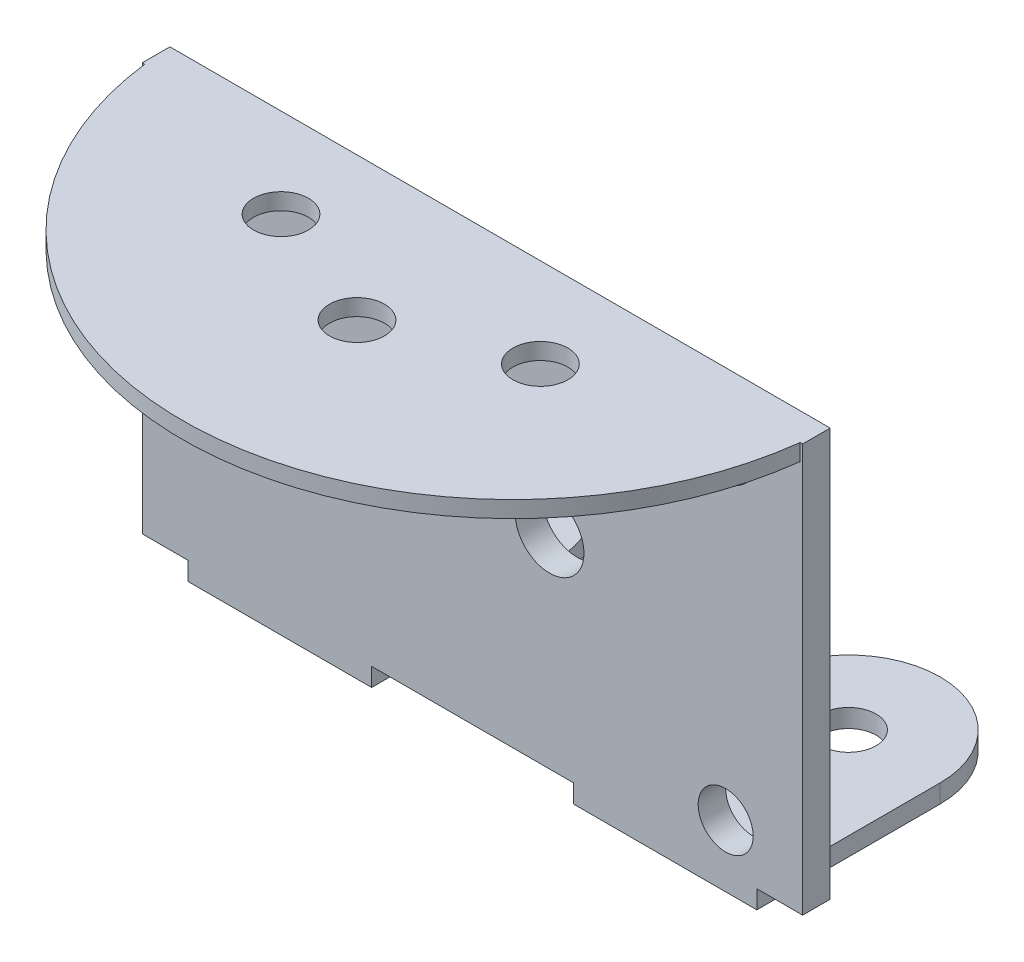
ISO-10303-21;
HEADER;
FILE_DESCRIPTION(('STEP AP214'),'2;1');
FILE_NAME('part.step','',(''),(''),'','','');
FILE_SCHEMA(('AUTOMOTIVE_DESIGN { 1 0 10303 214 1 1 1 1 }'));
ENDSEC;
DATA;
#1=APPLICATION_CONTEXT('core data for automotive mechanical design processes');
#2=APPLICATION_PROTOCOL_DEFINITION('international standard','automotive_design',2000,#1);
#3=PRODUCT_CONTEXT('',#1,'mechanical');
#4=PRODUCT('Part','Part','',(#3));
#5=PRODUCT_RELATED_PRODUCT_CATEGORY('part','',(#4));
#6=PRODUCT_DEFINITION_FORMATION('','',#4);
#7=PRODUCT_DEFINITION_CONTEXT('part definition',#1,'design');
#8=PRODUCT_DEFINITION('design','',#6,#7);
#9=PRODUCT_DEFINITION_SHAPE('','',#8);
#10=(LENGTH_UNIT() NAMED_UNIT(*) SI_UNIT(.MILLI.,.METRE.));
#11=(NAMED_UNIT(*) PLANE_ANGLE_UNIT() SI_UNIT($,.RADIAN.));
#12=(NAMED_UNIT(*) SI_UNIT($,.STERADIAN.) SOLID_ANGLE_UNIT());
#13=UNCERTAINTY_MEASURE_WITH_UNIT(LENGTH_MEASURE(1.E-05),#10,'distance_accuracy_value','');
#14=(GEOMETRIC_REPRESENTATION_CONTEXT(3) GLOBAL_UNCERTAINTY_ASSIGNED_CONTEXT((#13)) GLOBAL_UNIT_ASSIGNED_CONTEXT((#10,
#11,#12)) REPRESENTATION_CONTEXT('',''));
#15=CARTESIAN_POINT('',(0.,0.,0.));
#16=DIRECTION('',(0.,0.,1.));
#17=DIRECTION('',(1.,0.,0.));
#18=AXIS2_PLACEMENT_3D('',#15,#16,#17);
#19=CARTESIAN_POINT('',(13.8,8.74499999999999,1.5));
#20=DIRECTION('',(0.,0.,-1.));
#21=DIRECTION('',(-1.,0.,0.));
#22=AXIS2_PLACEMENT_3D('',#19,#20,#21);
#23=CYLINDRICAL_SURFACE('',#22,1.5);
#24=CARTESIAN_POINT('',(13.8,8.74499999999999,1.5));
#25=DIRECTION('',(0.,0.,1.));
#26=DIRECTION('',(1.,0.,0.));
#27=AXIS2_PLACEMENT_3D('',#24,#25,#26);
#28=CIRCLE('',#27,1.5);
#29=CARTESIAN_POINT('',(13.5558688876854,10.225,1.5));
#30=VERTEX_POINT('',#29);
#31=CARTESIAN_POINT('',(14.0441311123146,10.225,1.5));
#32=VERTEX_POINT('',#31);
#33=EDGE_CURVE('E187',#30,#32,#28,.T.);
#34=ORIENTED_EDGE('',*,*,#33,.T.);
#35=DIRECTION('',(0.,0.,-1.));
#36=VECTOR('',#35,1.);
#37=CARTESIAN_POINT('',(14.0441311123146,10.225,1.5));
#38=LINE('',#37,#36);
#39=CARTESIAN_POINT('',(14.0441311123146,10.225,0.));
#40=VERTEX_POINT('',#39);
#41=EDGE_CURVE('E11',#32,#40,#38,.T.);
#42=ORIENTED_EDGE('',*,*,#41,.T.);
#43=CARTESIAN_POINT('',(13.8,8.74499999999999,0.));
#44=DIRECTION('',(0.,0.,1.));
#45=DIRECTION('',(1.,0.,0.));
#46=AXIS2_PLACEMENT_3D('',#43,#44,#45);
#47=CIRCLE('',#46,1.5);
#48=CARTESIAN_POINT('',(13.5558688876854,10.225,0.));
#49=VERTEX_POINT('',#48);
#50=EDGE_CURVE('E286',#49,#40,#47,.T.);
#51=ORIENTED_EDGE('',*,*,#50,.F.);
#52=DIRECTION('',(0.,0.,-1.));
#53=VECTOR('',#52,1.);
#54=CARTESIAN_POINT('',(13.5558688876854,10.225,1.5));
#55=LINE('',#54,#53);
#56=EDGE_CURVE('E47',#49,#30,#55,.F.);
#57=ORIENTED_EDGE('',*,*,#56,.T.);
#58=EDGE_LOOP('',(#34,#42,#51,#57));
#59=FACE_BOUND('',#58,.T.);
#60=ADVANCED_FACE('F39',(#59),#23,.F.);
#61=CARTESIAN_POINT('',(-18.,-11.125,1.5));
#62=DIRECTION('',(0.,1.,0.));
#63=DIRECTION('',(-1.,0.,0.));
#64=AXIS2_PLACEMENT_3D('',#61,#62,#63);
#65=PLANE('',#64);
#66=DIRECTION('',(0.,0.,1.));
#67=VECTOR('',#66,1.);
#68=CARTESIAN_POINT('',(15.5,-11.125,0.));
#69=LINE('',#68,#67);
#70=CARTESIAN_POINT('',(15.5,-11.125,0.));
#71=VERTEX_POINT('',#70);
#72=CARTESIAN_POINT('',(15.5,-11.125,1.5));
#73=VERTEX_POINT('',#72);
#74=EDGE_CURVE('E220',#71,#73,#69,.T.);
#75=ORIENTED_EDGE('',*,*,#74,.F.);
#76=DIRECTION('',(1.,0.,0.));
#77=VECTOR('',#76,1.);
#78=CARTESIAN_POINT('',(-18.,-11.125,0.));
#79=LINE('',#78,#77);
#80=CARTESIAN_POINT('',(18.,-11.125,0.));
#81=VERTEX_POINT('',#80);
#82=EDGE_CURVE('E314',#71,#81,#79,.T.);
#83=ORIENTED_EDGE('',*,*,#82,.T.);
#84=DIRECTION('',(0.,0.,-1.));
#85=VECTOR('',#84,1.);
#86=CARTESIAN_POINT('',(18.,-11.125,1.5));
#87=LINE('',#86,#85);
#88=CARTESIAN_POINT('',(18.,-11.125,1.5));
#89=VERTEX_POINT('',#88);
#90=EDGE_CURVE('E306',#89,#81,#87,.T.);
#91=ORIENTED_EDGE('',*,*,#90,.F.);
#92=DIRECTION('',(1.,0.,0.));
#93=VECTOR('',#92,1.);
#94=CARTESIAN_POINT('',(-18.,-11.125,1.5));
#95=LINE('',#94,#93);
#96=EDGE_CURVE('E62',#73,#89,#95,.T.);
#97=ORIENTED_EDGE('',*,*,#96,.F.);
#98=EDGE_LOOP('',(#75,#83,#91,#97));
#99=FACE_BOUND('',#98,.T.);
#100=ADVANCED_FACE('F371',(#99),#65,.F.);
#101=CARTESIAN_POINT('',(-5.49999999999999,-11.125,0.));
#102=VERTEX_POINT('',#101);
#103=CARTESIAN_POINT('',(5.50000000000001,-11.125,0.));
#104=VERTEX_POINT('',#103);
#105=EDGE_CURVE('E733',#102,#104,#79,.T.);
#106=ORIENTED_EDGE('',*,*,#105,.T.);
#107=DIRECTION('',(0.,0.,1.));
#108=VECTOR('',#107,1.);
#109=CARTESIAN_POINT('',(5.50000000000001,-11.125,0.));
#110=LINE('',#109,#108);
#111=CARTESIAN_POINT('',(5.50000000000001,-11.125,1.5));
#112=VERTEX_POINT('',#111);
#113=EDGE_CURVE('E213',#104,#112,#110,.T.);
#114=ORIENTED_EDGE('',*,*,#113,.T.);
#115=CARTESIAN_POINT('',(-5.49999999999999,-11.125,1.5));
#116=VERTEX_POINT('',#115);
#117=EDGE_CURVE('E307',#116,#112,#95,.T.);
#118=ORIENTED_EDGE('',*,*,#117,.F.);
#119=DIRECTION('',(0.,0.,1.));
#120=VECTOR('',#119,1.);
#121=CARTESIAN_POINT('',(-5.49999999999999,-11.125,0.));
#122=LINE('',#121,#120);
#123=EDGE_CURVE('E255',#102,#116,#122,.T.);
#124=ORIENTED_EDGE('',*,*,#123,.F.);
#125=EDGE_LOOP('',(#106,#114,#118,#124));
#126=FACE_BOUND('',#125,.T.);
#127=ADVANCED_FACE('F376',(#126),#65,.F.);
#128=CARTESIAN_POINT('',(0.,0.,1.5));
#129=DIRECTION('',(0.,0.,-1.));
#130=DIRECTION('',(-1.,0.,0.));
#131=AXIS2_PLACEMENT_3D('',#128,#129,#130);
#132=PLANE('',#131);
#133=DIRECTION('',(1.,0.,0.));
#134=VECTOR('',#133,1.);
#135=CARTESIAN_POINT('',(0.,10.225,1.5));
#136=LINE('',#135,#134);
#137=CARTESIAN_POINT('',(-17.8650496780726,10.225,1.5));
#138=VERTEX_POINT('',#137);
#139=EDGE_CURVE('E54',#138,#30,#136,.T.);
#140=ORIENTED_EDGE('',*,*,#139,.F.);
#141=DIRECTION('',(0.,1.,0.));
#142=VECTOR('',#141,1.);
#143=CARTESIAN_POINT('',(-17.8650496780726,10.225,1.5));
#144=LINE('',#143,#142);
#145=CARTESIAN_POINT('',(-17.8650496780726,11.125,1.5));
#146=VERTEX_POINT('',#145);
#147=EDGE_CURVE('E166',#138,#146,#144,.T.);
#148=ORIENTED_EDGE('',*,*,#147,.T.);
#149=DIRECTION('',(-1.,0.,0.));
#150=VECTOR('',#149,1.);
#151=CARTESIAN_POINT('',(-18.,11.125,1.5));
#152=LINE('',#151,#150);
#153=CARTESIAN_POINT('',(-18.,11.125,1.5));
#154=VERTEX_POINT('',#153);
#155=EDGE_CURVE('E296',#146,#154,#152,.T.);
#156=ORIENTED_EDGE('',*,*,#155,.T.);
#157=DIRECTION('',(0.,-1.,0.));
#158=VECTOR('',#157,1.);
#159=CARTESIAN_POINT('',(-18.,-11.125,1.5));
#160=LINE('',#159,#158);
#161=CARTESIAN_POINT('',(-18.,-11.125,1.5));
#162=VERTEX_POINT('',#161);
#163=EDGE_CURVE('E301',#154,#162,#160,.T.);
#164=ORIENTED_EDGE('',*,*,#163,.T.);
#165=CARTESIAN_POINT('',(-15.5,-11.125,1.5));
#166=VERTEX_POINT('',#165);
#167=EDGE_CURVE('E303',#162,#166,#95,.T.);
#168=ORIENTED_EDGE('',*,*,#167,.T.);
#169=DIRECTION('',(0.,1.,0.));
#170=VECTOR('',#169,1.);
#171=CARTESIAN_POINT('',(-15.5,-12.125,1.5));
#172=LINE('',#171,#170);
#173=CARTESIAN_POINT('',(-15.5,-12.125,1.5));
#174=VERTEX_POINT('',#173);
#175=EDGE_CURVE('E262',#174,#166,#172,.T.);
#176=ORIENTED_EDGE('',*,*,#175,.F.);
#177=DIRECTION('',(-1.,0.,0.));
#178=VECTOR('',#177,1.);
#179=CARTESIAN_POINT('',(0.,-12.125,1.5));
#180=LINE('',#179,#178);
#181=CARTESIAN_POINT('',(-5.49999999999999,-12.125,1.5));
#182=VERTEX_POINT('',#181);
#183=EDGE_CURVE('E240',#182,#174,#180,.T.);
#184=ORIENTED_EDGE('',*,*,#183,.F.);
#185=DIRECTION('',(0.,1.,0.));
#186=VECTOR('',#185,1.);
#187=CARTESIAN_POINT('',(-5.49999999999999,-12.125,1.5));
#188=LINE('',#187,#186);
#189=EDGE_CURVE('E265',#182,#116,#188,.T.);
#190=ORIENTED_EDGE('',*,*,#189,.T.);
#191=ORIENTED_EDGE('',*,*,#117,.T.);
#192=DIRECTION('',(0.,1.,0.));
#193=VECTOR('',#192,1.);
#194=CARTESIAN_POINT('',(5.50000000000001,-12.125,1.5));
#195=LINE('',#194,#193);
#196=CARTESIAN_POINT('',(5.50000000000001,-12.125,1.5));
#197=VERTEX_POINT('',#196);
#198=EDGE_CURVE('E210',#197,#112,#195,.T.);
#199=ORIENTED_EDGE('',*,*,#198,.F.);
#200=DIRECTION('',(-1.,0.,0.));
#201=VECTOR('',#200,1.);
#202=CARTESIAN_POINT('',(0.,-12.125,1.5));
#203=LINE('',#202,#201);
#204=CARTESIAN_POINT('',(15.5,-12.125,1.5));
#205=VERTEX_POINT('',#204);
#206=EDGE_CURVE('E208',#205,#197,#203,.T.);
#207=ORIENTED_EDGE('',*,*,#206,.F.);
#208=DIRECTION('',(0.,1.,0.));
#209=VECTOR('',#208,1.);
#210=CARTESIAN_POINT('',(15.5,-12.125,1.5));
#211=LINE('',#210,#209);
#212=EDGE_CURVE('E225',#205,#73,#211,.T.);
#213=ORIENTED_EDGE('',*,*,#212,.T.);
#214=ORIENTED_EDGE('',*,*,#96,.T.);
#215=DIRECTION('',(0.,1.,0.));
#216=VECTOR('',#215,1.);
#217=CARTESIAN_POINT('',(18.,-11.125,1.5));
#218=LINE('',#217,#216);
#219=CARTESIAN_POINT('',(18.,11.125,1.5));
#220=VERTEX_POINT('',#219);
#221=EDGE_CURVE('E293',#89,#220,#218,.T.);
#222=ORIENTED_EDGE('',*,*,#221,.T.);
#223=CARTESIAN_POINT('',(17.8650496780725,11.125,1.5));
#224=VERTEX_POINT('',#223);
#225=EDGE_CURVE('E298',#220,#224,#152,.T.);
#226=ORIENTED_EDGE('',*,*,#225,.T.);
#227=DIRECTION('',(0.,1.,0.));
#228=VECTOR('',#227,1.);
#229=CARTESIAN_POINT('',(17.8650496780725,10.225,1.5));
#230=LINE('',#229,#228);
#231=CARTESIAN_POINT('',(17.8650496780725,10.225,1.5));
#232=VERTEX_POINT('',#231);
#233=EDGE_CURVE('E175',#224,#232,#230,.F.);
#234=ORIENTED_EDGE('',*,*,#233,.T.);
#235=EDGE_CURVE('E179',#32,#232,#136,.T.);
#236=ORIENTED_EDGE('',*,*,#235,.F.);
#237=ORIENTED_EDGE('',*,*,#33,.F.);
#238=EDGE_LOOP('',(#140,#148,#156,#164,#168,#176,#184,#190,#191,#199,#207,#213,#214,#222,#226,
#234,#236,#237));
#239=FACE_BOUND('',#238,.T.);
#240=CARTESIAN_POINT('',(-6.8,0.,1.5));
#241=DIRECTION('',(0.,0.,1.));
#242=DIRECTION('',(1.,0.,0.));
#243=AXIS2_PLACEMENT_3D('',#240,#241,#242);
#244=CIRCLE('',#243,3.05);
#245=CARTESIAN_POINT('',(-3.75,0.,1.5));
#246=VERTEX_POINT('',#245);
#247=EDGE_CURVE('E283',#246,#246,#244,.T.);
#248=ORIENTED_EDGE('',*,*,#247,.F.);
#249=EDGE_LOOP('',(#248));
#250=FACE_BOUND('',#249,.T.);
#251=CARTESIAN_POINT('',(13.8,-8.74499999999999,1.5));
#252=DIRECTION('',(0.,0.,1.));
#253=DIRECTION('',(-1.,0.,0.));
#254=AXIS2_PLACEMENT_3D('',#251,#252,#253);
#255=CIRCLE('',#254,1.5);
#256=CARTESIAN_POINT('',(12.3,-8.74499999999999,1.5));
#257=VERTEX_POINT('',#256);
#258=EDGE_CURVE('E277',#257,#257,#255,.T.);
#259=ORIENTED_EDGE('',*,*,#258,.F.);
#260=EDGE_LOOP('',(#259));
#261=FACE_BOUND('',#260,.T.);
#262=CARTESIAN_POINT('',(4.2,0.,1.5));
#263=DIRECTION('',(0.,0.,1.));
#264=DIRECTION('',(1.,0.,0.));
#265=AXIS2_PLACEMENT_3D('',#262,#263,#264);
#266=CIRCLE('',#265,1.875);
#267=CARTESIAN_POINT('',(6.075,0.,1.5));
#268=VERTEX_POINT('',#267);
#269=EDGE_CURVE('E271',#268,#268,#266,.T.);
#270=ORIENTED_EDGE('',*,*,#269,.F.);
#271=EDGE_LOOP('',(#270));
#272=FACE_BOUND('',#271,.T.);
#273=ADVANCED_FACE('F184',(#239,#250,#261,#272),#132,.F.);
#274=CARTESIAN_POINT('',(0.,0.,0.));
#275=DIRECTION('',(0.,0.,-1.));
#276=DIRECTION('',(-1.,0.,0.));
#277=AXIS2_PLACEMENT_3D('',#274,#275,#276);
#278=PLANE('',#277);
#279=DIRECTION('',(0.,-1.,0.));
#280=VECTOR('',#279,1.);
#281=CARTESIAN_POINT('',(-18.,-11.125,0.));
#282=LINE('',#281,#280);
#283=CARTESIAN_POINT('',(-18.,11.125,0.));
#284=VERTEX_POINT('',#283);
#285=CARTESIAN_POINT('',(-18.,-11.125,0.));
#286=VERTEX_POINT('',#285);
#287=EDGE_CURVE('E312',#284,#286,#282,.T.);
#288=ORIENTED_EDGE('',*,*,#287,.F.);
#289=DIRECTION('',(-1.,0.,0.));
#290=VECTOR('',#289,1.);
#291=CARTESIAN_POINT('',(-18.,11.125,0.));
#292=LINE('',#291,#290);
#293=CARTESIAN_POINT('',(18.,11.125,0.));
#294=VERTEX_POINT('',#293);
#295=EDGE_CURVE('E310',#294,#284,#292,.T.);
#296=ORIENTED_EDGE('',*,*,#295,.F.);
#297=DIRECTION('',(0.,1.,0.));
#298=VECTOR('',#297,1.);
#299=CARTESIAN_POINT('',(18.,-11.125,0.));
#300=LINE('',#299,#298);
#301=EDGE_CURVE('E290',#81,#294,#300,.T.);
#302=ORIENTED_EDGE('',*,*,#301,.F.);
#303=ORIENTED_EDGE('',*,*,#82,.F.);
#304=EDGE_CURVE('E735',#104,#71,#79,.T.);
#305=ORIENTED_EDGE('',*,*,#304,.F.);
#306=ORIENTED_EDGE('',*,*,#105,.F.);
#307=CARTESIAN_POINT('',(-15.5,-11.125,0.));
#308=VERTEX_POINT('',#307);
#309=EDGE_CURVE('E317',#308,#102,#79,.T.);
#310=ORIENTED_EDGE('',*,*,#309,.F.);
#311=EDGE_CURVE('E297',#286,#308,#79,.T.);
#312=ORIENTED_EDGE('',*,*,#311,.F.);
#313=EDGE_LOOP('',(#288,#296,#302,#303,#305,#306,#310,#312));
#314=FACE_BOUND('',#313,.T.);
#315=DIRECTION('',(-1.,0.,0.));
#316=VECTOR('',#315,1.);
#317=CARTESIAN_POINT('',(0.,10.225,0.));
#318=LINE('',#317,#316);
#319=EDGE_CURVE('E180',#40,#49,#318,.T.);
#320=ORIENTED_EDGE('',*,*,#319,.T.);
#321=ORIENTED_EDGE('',*,*,#50,.T.);
#322=EDGE_LOOP('',(#320,#321));
#323=FACE_BOUND('',#322,.T.);
#324=CARTESIAN_POINT('',(13.8,-8.74499999999999,0.));
#325=DIRECTION('',(0.,0.,1.));
#326=DIRECTION('',(-1.,0.,0.));
#327=AXIS2_PLACEMENT_3D('',#324,#325,#326);
#328=CIRCLE('',#327,1.5);
#329=CARTESIAN_POINT('',(12.3,-8.74499999999999,0.));
#330=VERTEX_POINT('',#329);
#331=EDGE_CURVE('E274',#330,#330,#328,.T.);
#332=ORIENTED_EDGE('',*,*,#331,.T.);
#333=EDGE_LOOP('',(#332));
#334=FACE_BOUND('',#333,.T.);
#335=CARTESIAN_POINT('',(-6.8,0.,0.));
#336=DIRECTION('',(0.,0.,1.));
#337=DIRECTION('',(1.,0.,0.));
#338=AXIS2_PLACEMENT_3D('',#335,#336,#337);
#339=CIRCLE('',#338,3.05);
#340=CARTESIAN_POINT('',(-3.75,0.,0.));
#341=VERTEX_POINT('',#340);
#342=EDGE_CURVE('E280',#341,#341,#339,.T.);
#343=ORIENTED_EDGE('',*,*,#342,.T.);
#344=EDGE_LOOP('',(#343));
#345=FACE_BOUND('',#344,.T.);
#346=CARTESIAN_POINT('',(4.2,0.,0.));
#347=DIRECTION('',(0.,0.,1.));
#348=DIRECTION('',(1.,0.,0.));
#349=AXIS2_PLACEMENT_3D('',#346,#347,#348);
#350=CIRCLE('',#349,1.875);
#351=CARTESIAN_POINT('',(6.075,0.,0.));
#352=VERTEX_POINT('',#351);
#353=EDGE_CURVE('E270',#352,#352,#350,.T.);
#354=ORIENTED_EDGE('',*,*,#353,.T.);
#355=EDGE_LOOP('',(#354));
#356=FACE_BOUND('',#355,.T.);
#357=ADVANCED_FACE('F385',(#314,#323,#334,#345,#356),#278,.T.);
#358=CARTESIAN_POINT('',(18.,-11.125,1.5));
#359=DIRECTION('',(-1.,0.,0.));
#360=DIRECTION('',(0.,-1.,0.));
#361=AXIS2_PLACEMENT_3D('',#358,#359,#360);
#362=PLANE('',#361);
#363=ORIENTED_EDGE('',*,*,#301,.T.);
#364=DIRECTION('',(0.,0.,-1.));
#365=VECTOR('',#364,1.);
#366=CARTESIAN_POINT('',(18.,11.125,1.5));
#367=LINE('',#366,#365);
#368=EDGE_CURVE('E326',#220,#294,#367,.T.);
#369=ORIENTED_EDGE('',*,*,#368,.F.);
#370=ORIENTED_EDGE('',*,*,#221,.F.);
#371=ORIENTED_EDGE('',*,*,#90,.T.);
#372=EDGE_LOOP('',(#363,#369,#370,#371));
#373=FACE_BOUND('',#372,.T.);
#374=ADVANCED_FACE('F41',(#373),#362,.F.);
#375=CARTESIAN_POINT('',(-18.,11.125,1.5));
#376=DIRECTION('',(0.,-1.,0.));
#377=DIRECTION('',(1.,0.,0.));
#378=AXIS2_PLACEMENT_3D('',#375,#376,#377);
#379=PLANE('',#378);
#380=ORIENTED_EDGE('',*,*,#155,.F.);
#381=CARTESIAN_POINT('',(0.,11.125,-0.7));
#382=DIRECTION('',(0.,1.,0.));
#383=DIRECTION('',(-1.,0.,0.));
#384=AXIS2_PLACEMENT_3D('',#381,#382,#383);
#385=CIRCLE('',#384,18.);
#386=EDGE_CURVE('E171',#146,#224,#385,.T.);
#387=ORIENTED_EDGE('',*,*,#386,.T.);
#388=ORIENTED_EDGE('',*,*,#225,.F.);
#389=ORIENTED_EDGE('',*,*,#368,.T.);
#390=ORIENTED_EDGE('',*,*,#295,.T.);
#391=DIRECTION('',(0.,0.,-1.));
#392=VECTOR('',#391,1.);
#393=CARTESIAN_POINT('',(-18.,11.125,1.5));
#394=LINE('',#393,#392);
#395=EDGE_CURVE('E323',#154,#284,#394,.T.);
#396=ORIENTED_EDGE('',*,*,#395,.F.);
#397=EDGE_LOOP('',(#380,#387,#388,#389,#390,#396));
#398=FACE_BOUND('',#397,.T.);
#399=CARTESIAN_POINT('',(0.,11.125,7.8));
#400=DIRECTION('',(0.,1.,0.));
#401=DIRECTION('',(-1.,0.,0.));
#402=AXIS2_PLACEMENT_3D('',#399,#400,#401);
#403=CIRCLE('',#402,1.5);
#404=CARTESIAN_POINT('',(-1.5,11.125,7.8));
#405=VERTEX_POINT('',#404);
#406=EDGE_CURVE('E405',#405,#405,#403,.T.);
#407=ORIENTED_EDGE('',*,*,#406,.F.);
#408=EDGE_LOOP('',(#407));
#409=FACE_BOUND('',#408,.T.);
#410=CARTESIAN_POINT('',(-7.07106781186548,11.125,4.87106781186548));
#411=DIRECTION('',(0.,1.,0.));
#412=DIRECTION('',(-1.,0.,0.));
#413=AXIS2_PLACEMENT_3D('',#410,#411,#412);
#414=CIRCLE('',#413,1.50000000123648);
#415=CARTESIAN_POINT('',(-8.57106781310195,11.125,4.87106781186548));
#416=VERTEX_POINT('',#415);
#417=EDGE_CURVE('E409',#416,#416,#414,.T.);
#418=ORIENTED_EDGE('',*,*,#417,.F.);
#419=EDGE_LOOP('',(#418));
#420=FACE_BOUND('',#419,.T.);
#421=CARTESIAN_POINT('',(7.07106781186547,11.125,4.87106781186547));
#422=DIRECTION('',(0.,1.,0.));
#423=DIRECTION('',(-1.,0.,0.));
#424=AXIS2_PLACEMENT_3D('',#421,#422,#423);
#425=CIRCLE('',#424,1.50000000018634);
#426=CARTESIAN_POINT('',(5.57106781167913,11.125,4.87106781186547));
#427=VERTEX_POINT('',#426);
#428=EDGE_CURVE('E412',#427,#427,#425,.T.);
#429=ORIENTED_EDGE('',*,*,#428,.F.);
#430=EDGE_LOOP('',(#429));
#431=FACE_BOUND('',#430,.T.);
#432=ADVANCED_FACE('F392',(#398,#409,#420,#431),#379,.F.);
#433=CARTESIAN_POINT('',(-18.,-11.125,1.5));
#434=DIRECTION('',(1.,0.,0.));
#435=DIRECTION('',(0.,1.,0.));
#436=AXIS2_PLACEMENT_3D('',#433,#434,#435);
#437=PLANE('',#436);
#438=ORIENTED_EDGE('',*,*,#287,.T.);
#439=DIRECTION('',(0.,0.,-1.));
#440=VECTOR('',#439,1.);
#441=CARTESIAN_POINT('',(-18.,-11.125,1.5));
#442=LINE('',#441,#440);
#443=EDGE_CURVE('E320',#162,#286,#442,.T.);
#444=ORIENTED_EDGE('',*,*,#443,.F.);
#445=ORIENTED_EDGE('',*,*,#163,.F.);
#446=ORIENTED_EDGE('',*,*,#395,.T.);
#447=EDGE_LOOP('',(#438,#444,#445,#446));
#448=FACE_BOUND('',#447,.T.);
#449=ADVANCED_FACE('F390',(#448),#437,.F.);
#450=ORIENTED_EDGE('',*,*,#311,.T.);
#451=DIRECTION('',(0.,0.,1.));
#452=VECTOR('',#451,1.);
#453=CARTESIAN_POINT('',(-15.5,-11.125,0.));
#454=LINE('',#453,#452);
#455=EDGE_CURVE('E258',#308,#166,#454,.T.);
#456=ORIENTED_EDGE('',*,*,#455,.T.);
#457=ORIENTED_EDGE('',*,*,#167,.F.);
#458=ORIENTED_EDGE('',*,*,#443,.T.);
#459=EDGE_LOOP('',(#450,#456,#457,#458));
#460=FACE_BOUND('',#459,.T.);
#461=ADVANCED_FACE('F378',(#460),#65,.F.);
#462=CARTESIAN_POINT('',(-6.8,0.,1.5));
#463=DIRECTION('',(0.,0.,-1.));
#464=DIRECTION('',(-1.,0.,0.));
#465=AXIS2_PLACEMENT_3D('',#462,#463,#464);
#466=CYLINDRICAL_SURFACE('',#465,3.05);
#467=ORIENTED_EDGE('',*,*,#247,.T.);
#468=EDGE_LOOP('',(#467));
#469=FACE_BOUND('',#468,.T.);
#470=ORIENTED_EDGE('',*,*,#342,.F.);
#471=EDGE_LOOP('',(#470));
#472=FACE_BOUND('',#471,.T.);
#473=ADVANCED_FACE('F381',(#469,#472),#466,.F.);
#474=CARTESIAN_POINT('',(13.8,-8.74499999999999,1.5));
#475=DIRECTION('',(0.,0.,-1.));
#476=DIRECTION('',(-1.,0.,0.));
#477=AXIS2_PLACEMENT_3D('',#474,#475,#476);
#478=CYLINDRICAL_SURFACE('',#477,1.5);
#479=ORIENTED_EDGE('',*,*,#258,.T.);
#480=EDGE_LOOP('',(#479));
#481=FACE_BOUND('',#480,.T.);
#482=ORIENTED_EDGE('',*,*,#331,.F.);
#483=EDGE_LOOP('',(#482));
#484=FACE_BOUND('',#483,.T.);
#485=ADVANCED_FACE('F481',(#481,#484),#478,.F.);
#486=CARTESIAN_POINT('',(4.2,0.,1.5));
#487=DIRECTION('',(0.,0.,-1.));
#488=DIRECTION('',(-1.,0.,0.));
#489=AXIS2_PLACEMENT_3D('',#486,#487,#488);
#490=CYLINDRICAL_SURFACE('',#489,1.875);
#491=ORIENTED_EDGE('',*,*,#269,.T.);
#492=EDGE_LOOP('',(#491));
#493=FACE_BOUND('',#492,.T.);
#494=ORIENTED_EDGE('',*,*,#353,.F.);
#495=EDGE_LOOP('',(#494));
#496=FACE_BOUND('',#495,.T.);
#497=ADVANCED_FACE('F474',(#493,#496),#490,.F.);
#498=CARTESIAN_POINT('',(0.,-11.125,0.));
#499=DIRECTION('',(0.,-1.,0.));
#500=DIRECTION('',(1.,0.,0.));
#501=AXIS2_PLACEMENT_3D('',#498,#499,#500);
#502=PLANE('',#501);
#503=CARTESIAN_POINT('',(-10.5,-11.125,-8.5));
#504=DIRECTION('',(0.,-1.,0.));
#505=DIRECTION('',(1.,0.,0.));
#506=AXIS2_PLACEMENT_3D('',#503,#504,#505);
#507=CIRCLE('',#506,1.5);
#508=CARTESIAN_POINT('',(-8.99999999999999,-11.125,-8.5));
#509=VERTEX_POINT('',#508);
#510=EDGE_CURVE('E238',#509,#509,#507,.F.);
#511=ORIENTED_EDGE('',*,*,#510,.F.);
#512=EDGE_LOOP('',(#511));
#513=FACE_BOUND('',#512,.T.);
#514=CARTESIAN_POINT('',(-15.5,-11.125,-8.5));
#515=VERTEX_POINT('',#514);
#516=EDGE_CURVE('E254',#515,#308,#454,.T.);
#517=ORIENTED_EDGE('',*,*,#516,.T.);
#518=ORIENTED_EDGE('',*,*,#309,.T.);
#519=CARTESIAN_POINT('',(-5.49999999999999,-11.125,-8.5));
#520=VERTEX_POINT('',#519);
#521=EDGE_CURVE('E251',#520,#102,#122,.T.);
#522=ORIENTED_EDGE('',*,*,#521,.F.);
#523=CARTESIAN_POINT('',(-10.5,-11.125,-8.5));
#524=DIRECTION('',(0.,-1.,0.));
#525=DIRECTION('',(1.,0.,0.));
#526=AXIS2_PLACEMENT_3D('',#523,#524,#525);
#527=CIRCLE('',#526,5.);
#528=EDGE_CURVE('E233',#520,#515,#527,.F.);
#529=ORIENTED_EDGE('',*,*,#528,.T.);
#530=EDGE_LOOP('',(#517,#518,#522,#529));
#531=FACE_BOUND('',#530,.T.);
#532=ADVANCED_FACE('F355',(#513,#531),#502,.F.);
#533=CARTESIAN_POINT('',(-10.5,-12.125,-8.5));
#534=DIRECTION('',(0.,1.,0.));
#535=DIRECTION('',(-1.,0.,0.));
#536=AXIS2_PLACEMENT_3D('',#533,#534,#535);
#537=CYLINDRICAL_SURFACE('',#536,5.);
#538=ORIENTED_EDGE('',*,*,#528,.F.);
#539=DIRECTION('',(0.,1.,0.));
#540=VECTOR('',#539,1.);
#541=CARTESIAN_POINT('',(-5.49999999999999,-12.125,-8.5));
#542=LINE('',#541,#540);
#543=CARTESIAN_POINT('',(-5.49999999999999,-12.125,-8.5));
#544=VERTEX_POINT('',#543);
#545=EDGE_CURVE('E268',#544,#520,#542,.T.);
#546=ORIENTED_EDGE('',*,*,#545,.F.);
#547=CARTESIAN_POINT('',(-10.5,-12.125,-8.5));
#548=DIRECTION('',(0.,-1.,0.));
#549=DIRECTION('',(1.,0.,0.));
#550=AXIS2_PLACEMENT_3D('',#547,#548,#549);
#551=CIRCLE('',#550,5.);
#552=CARTESIAN_POINT('',(-15.5,-12.125,-8.5));
#553=VERTEX_POINT('',#552);
#554=EDGE_CURVE('E234',#544,#553,#551,.F.);
#555=ORIENTED_EDGE('',*,*,#554,.T.);
#556=DIRECTION('',(0.,1.,0.));
#557=VECTOR('',#556,1.);
#558=CARTESIAN_POINT('',(-15.5,-12.125,-8.5));
#559=LINE('',#558,#557);
#560=EDGE_CURVE('E248',#553,#515,#559,.T.);
#561=ORIENTED_EDGE('',*,*,#560,.T.);
#562=EDGE_LOOP('',(#538,#546,#555,#561));
#563=FACE_BOUND('',#562,.T.);
#564=ADVANCED_FACE('F357',(#563),#537,.T.);
#565=CARTESIAN_POINT('',(-5.49999999999999,-12.125,0.));
#566=DIRECTION('',(-1.,0.,0.));
#567=DIRECTION('',(0.,-1.,0.));
#568=AXIS2_PLACEMENT_3D('',#565,#566,#567);
#569=PLANE('',#568);
#570=ORIENTED_EDGE('',*,*,#521,.T.);
#571=ORIENTED_EDGE('',*,*,#123,.T.);
#572=ORIENTED_EDGE('',*,*,#189,.F.);
#573=DIRECTION('',(0.,0.,1.));
#574=VECTOR('',#573,1.);
#575=CARTESIAN_POINT('',(-5.49999999999999,-12.125,0.));
#576=LINE('',#575,#574);
#577=EDGE_CURVE('E237',#544,#182,#576,.T.);
#578=ORIENTED_EDGE('',*,*,#577,.F.);
#579=ORIENTED_EDGE('',*,*,#545,.T.);
#580=EDGE_LOOP('',(#570,#571,#572,#578,#579));
#581=FACE_BOUND('',#580,.T.);
#582=ADVANCED_FACE('F336',(#581),#569,.F.);
#583=CARTESIAN_POINT('',(-15.5,-12.125,0.));
#584=DIRECTION('',(-1.,0.,0.));
#585=DIRECTION('',(0.,0.,1.));
#586=AXIS2_PLACEMENT_3D('',#583,#584,#585);
#587=PLANE('',#586);
#588=ORIENTED_EDGE('',*,*,#516,.F.);
#589=ORIENTED_EDGE('',*,*,#560,.F.);
#590=DIRECTION('',(0.,0.,1.));
#591=VECTOR('',#590,1.);
#592=CARTESIAN_POINT('',(-15.5,-12.125,0.));
#593=LINE('',#592,#591);
#594=EDGE_CURVE('E242',#553,#174,#593,.T.);
#595=ORIENTED_EDGE('',*,*,#594,.T.);
#596=ORIENTED_EDGE('',*,*,#175,.T.);
#597=ORIENTED_EDGE('',*,*,#455,.F.);
#598=EDGE_LOOP('',(#588,#589,#595,#596,#597));
#599=FACE_BOUND('',#598,.T.);
#600=ADVANCED_FACE('F359',(#599),#587,.T.);
#601=CARTESIAN_POINT('',(-10.5,-12.125,-8.5));
#602=DIRECTION('',(0.,1.,0.));
#603=DIRECTION('',(-1.,0.,0.));
#604=AXIS2_PLACEMENT_3D('',#601,#602,#603);
#605=CYLINDRICAL_SURFACE('',#604,1.5);
#606=CARTESIAN_POINT('',(-10.5,-12.125,-8.5));
#607=DIRECTION('',(0.,-1.,0.));
#608=DIRECTION('',(1.,0.,0.));
#609=AXIS2_PLACEMENT_3D('',#606,#607,#608);
#610=CIRCLE('',#609,1.5);
#611=CARTESIAN_POINT('',(-8.99999999999999,-12.125,-8.5));
#612=VERTEX_POINT('',#611);
#613=EDGE_CURVE('E245',#612,#612,#610,.F.);
#614=ORIENTED_EDGE('',*,*,#613,.F.);
#615=EDGE_LOOP('',(#614));
#616=FACE_BOUND('',#615,.T.);
#617=ORIENTED_EDGE('',*,*,#510,.T.);
#618=EDGE_LOOP('',(#617));
#619=FACE_BOUND('',#618,.T.);
#620=ADVANCED_FACE('F361',(#616,#619),#605,.F.);
#621=CARTESIAN_POINT('',(0.,-12.125,0.));
#622=DIRECTION('',(0.,-1.,0.));
#623=DIRECTION('',(1.,0.,0.));
#624=AXIS2_PLACEMENT_3D('',#621,#622,#623);
#625=PLANE('',#624);
#626=ORIENTED_EDGE('',*,*,#554,.F.);
#627=ORIENTED_EDGE('',*,*,#577,.T.);
#628=ORIENTED_EDGE('',*,*,#183,.T.);
#629=ORIENTED_EDGE('',*,*,#594,.F.);
#630=EDGE_LOOP('',(#626,#627,#628,#629));
#631=FACE_BOUND('',#630,.T.);
#632=ORIENTED_EDGE('',*,*,#613,.T.);
#633=EDGE_LOOP('',(#632));
#634=FACE_BOUND('',#633,.T.);
#635=ADVANCED_FACE('F349',(#631,#634),#625,.T.);
#636=CARTESIAN_POINT('',(5.50000000000001,-12.125,0.));
#637=DIRECTION('',(-1.,0.,0.));
#638=DIRECTION('',(0.,-1.,0.));
#639=AXIS2_PLACEMENT_3D('',#636,#637,#638);
#640=PLANE('',#639);
#641=CARTESIAN_POINT('',(5.50000000000001,-11.125,-8.5));
#642=VERTEX_POINT('',#641);
#643=EDGE_CURVE('E214',#642,#104,#110,.T.);
#644=ORIENTED_EDGE('',*,*,#643,.F.);
#645=DIRECTION('',(0.,1.,0.));
#646=VECTOR('',#645,1.);
#647=CARTESIAN_POINT('',(5.50000000000001,-12.125,-8.5));
#648=LINE('',#647,#646);
#649=CARTESIAN_POINT('',(5.50000000000001,-12.125,-8.5));
#650=VERTEX_POINT('',#649);
#651=EDGE_CURVE('E231',#650,#642,#648,.T.);
#652=ORIENTED_EDGE('',*,*,#651,.F.);
#653=DIRECTION('',(0.,0.,1.));
#654=VECTOR('',#653,1.);
#655=CARTESIAN_POINT('',(5.50000000000001,-12.125,0.));
#656=LINE('',#655,#654);
#657=EDGE_CURVE('E198',#650,#197,#656,.T.);
#658=ORIENTED_EDGE('',*,*,#657,.T.);
#659=ORIENTED_EDGE('',*,*,#198,.T.);
#660=ORIENTED_EDGE('',*,*,#113,.F.);
#661=EDGE_LOOP('',(#644,#652,#658,#659,#660));
#662=FACE_BOUND('',#661,.T.);
#663=ADVANCED_FACE('F463',(#662),#640,.T.);
#664=CARTESIAN_POINT('',(10.5,-12.125,-8.5));
#665=DIRECTION('',(0.,1.,0.));
#666=DIRECTION('',(-1.,0.,0.));
#667=AXIS2_PLACEMENT_3D('',#664,#665,#666);
#668=CYLINDRICAL_SURFACE('',#667,5.);
#669=CARTESIAN_POINT('',(10.5,-11.125,-8.5));
#670=DIRECTION('',(0.,-1.,0.));
#671=DIRECTION('',(1.,0.,0.));
#672=AXIS2_PLACEMENT_3D('',#669,#670,#671);
#673=CIRCLE('',#672,5.);
#674=CARTESIAN_POINT('',(15.5,-11.125,-8.5));
#675=VERTEX_POINT('',#674);
#676=EDGE_CURVE('E217',#642,#675,#673,.T.);
#677=ORIENTED_EDGE('',*,*,#676,.T.);
#678=DIRECTION('',(0.,1.,0.));
#679=VECTOR('',#678,1.);
#680=CARTESIAN_POINT('',(15.5,-12.125,-8.5));
#681=LINE('',#680,#679);
#682=CARTESIAN_POINT('',(15.5,-12.125,-8.5));
#683=VERTEX_POINT('',#682);
#684=EDGE_CURVE('E228',#683,#675,#681,.T.);
#685=ORIENTED_EDGE('',*,*,#684,.F.);
#686=CARTESIAN_POINT('',(10.5,-12.125,-8.5));
#687=DIRECTION('',(0.,-1.,0.));
#688=DIRECTION('',(1.,0.,0.));
#689=AXIS2_PLACEMENT_3D('',#686,#687,#688);
#690=CIRCLE('',#689,5.);
#691=EDGE_CURVE('E202',#650,#683,#690,.T.);
#692=ORIENTED_EDGE('',*,*,#691,.F.);
#693=ORIENTED_EDGE('',*,*,#651,.T.);
#694=EDGE_LOOP('',(#677,#685,#692,#693));
#695=FACE_BOUND('',#694,.T.);
#696=ADVANCED_FACE('F459',(#695),#668,.T.);
#697=CARTESIAN_POINT('',(15.5,-12.125,0.));
#698=DIRECTION('',(-1.,0.,0.));
#699=DIRECTION('',(0.,0.,1.));
#700=AXIS2_PLACEMENT_3D('',#697,#698,#699);
#701=PLANE('',#700);
#702=EDGE_CURVE('E199',#675,#71,#69,.T.);
#703=ORIENTED_EDGE('',*,*,#702,.T.);
#704=ORIENTED_EDGE('',*,*,#74,.T.);
#705=ORIENTED_EDGE('',*,*,#212,.F.);
#706=DIRECTION('',(0.,0.,1.));
#707=VECTOR('',#706,1.);
#708=CARTESIAN_POINT('',(15.5,-12.125,0.));
#709=LINE('',#708,#707);
#710=EDGE_CURVE('E205',#683,#205,#709,.T.);
#711=ORIENTED_EDGE('',*,*,#710,.F.);
#712=ORIENTED_EDGE('',*,*,#684,.T.);
#713=EDGE_LOOP('',(#703,#704,#705,#711,#712));
#714=FACE_BOUND('',#713,.T.);
#715=ADVANCED_FACE('F456',(#714),#701,.F.);
#716=CARTESIAN_POINT('',(10.5,-12.125,-8.5));
#717=DIRECTION('',(0.,1.,0.));
#718=DIRECTION('',(-1.,0.,0.));
#719=AXIS2_PLACEMENT_3D('',#716,#717,#718);
#720=CYLINDRICAL_SURFACE('',#719,1.5);
#721=CARTESIAN_POINT('',(10.5,-12.125,-8.5));
#722=DIRECTION('',(0.,-1.,0.));
#723=DIRECTION('',(1.,0.,0.));
#724=AXIS2_PLACEMENT_3D('',#721,#722,#723);
#725=CIRCLE('',#724,1.5);
#726=CARTESIAN_POINT('',(12.,-12.125,-8.5));
#727=VERTEX_POINT('',#726);
#728=EDGE_CURVE('E195',#727,#727,#725,.T.);
#729=ORIENTED_EDGE('',*,*,#728,.T.);
#730=EDGE_LOOP('',(#729));
#731=FACE_BOUND('',#730,.T.);
#732=CARTESIAN_POINT('',(10.5,-11.125,-8.5));
#733=DIRECTION('',(0.,-1.,0.));
#734=DIRECTION('',(1.,0.,0.));
#735=AXIS2_PLACEMENT_3D('',#732,#733,#734);
#736=CIRCLE('',#735,1.5);
#737=CARTESIAN_POINT('',(12.,-11.125,-8.5));
#738=VERTEX_POINT('',#737);
#739=EDGE_CURVE('E174',#738,#738,#736,.T.);
#740=ORIENTED_EDGE('',*,*,#739,.F.);
#741=EDGE_LOOP('',(#740));
#742=FACE_BOUND('',#741,.T.);
#743=ADVANCED_FACE('F451',(#731,#742),#720,.F.);
#744=CARTESIAN_POINT('',(0.,-12.125,0.));
#745=DIRECTION('',(0.,-1.,0.));
#746=DIRECTION('',(1.,0.,0.));
#747=AXIS2_PLACEMENT_3D('',#744,#745,#746);
#748=PLANE('',#747);
#749=ORIENTED_EDGE('',*,*,#728,.F.);
#750=EDGE_LOOP('',(#749));
#751=FACE_BOUND('',#750,.T.);
#752=ORIENTED_EDGE('',*,*,#657,.F.);
#753=ORIENTED_EDGE('',*,*,#691,.T.);
#754=ORIENTED_EDGE('',*,*,#710,.T.);
#755=ORIENTED_EDGE('',*,*,#206,.T.);
#756=EDGE_LOOP('',(#752,#753,#754,#755));
#757=FACE_BOUND('',#756,.T.);
#758=ADVANCED_FACE('F447',(#751,#757),#748,.T.);
#759=CARTESIAN_POINT('',(0.,-11.125,0.));
#760=DIRECTION('',(0.,-1.,0.));
#761=DIRECTION('',(1.,0.,0.));
#762=AXIS2_PLACEMENT_3D('',#759,#760,#761);
#763=PLANE('',#762);
#764=ORIENTED_EDGE('',*,*,#304,.T.);
#765=ORIENTED_EDGE('',*,*,#702,.F.);
#766=ORIENTED_EDGE('',*,*,#676,.F.);
#767=ORIENTED_EDGE('',*,*,#643,.T.);
#768=EDGE_LOOP('',(#764,#765,#766,#767));
#769=FACE_BOUND('',#768,.T.);
#770=ORIENTED_EDGE('',*,*,#739,.T.);
#771=EDGE_LOOP('',(#770));
#772=FACE_BOUND('',#771,.T.);
#773=ADVANCED_FACE('F450',(#769,#772),#763,.F.);
#774=CARTESIAN_POINT('',(0.,10.225,-0.7));
#775=DIRECTION('',(0.,1.,0.));
#776=DIRECTION('',(-1.,0.,0.));
#777=AXIS2_PLACEMENT_3D('',#774,#775,#776);
#778=CYLINDRICAL_SURFACE('',#777,18.);
#779=ORIENTED_EDGE('',*,*,#147,.F.);
#780=CARTESIAN_POINT('',(0.,10.225,-0.7));
#781=DIRECTION('',(0.,1.,0.));
#782=DIRECTION('',(-1.,0.,0.));
#783=AXIS2_PLACEMENT_3D('',#780,#781,#782);
#784=CIRCLE('',#783,18.);
#785=EDGE_CURVE('E168',#138,#232,#784,.T.);
#786=ORIENTED_EDGE('',*,*,#785,.T.);
#787=ORIENTED_EDGE('',*,*,#233,.F.);
#788=ORIENTED_EDGE('',*,*,#386,.F.);
#789=EDGE_LOOP('',(#779,#786,#787,#788));
#790=FACE_BOUND('',#789,.T.);
#791=ADVANCED_FACE('F167',(#790),#778,.T.);
#792=CARTESIAN_POINT('',(0.,10.225,0.));
#793=DIRECTION('',(0.,1.,0.));
#794=DIRECTION('',(-1.,0.,0.));
#795=AXIS2_PLACEMENT_3D('',#792,#793,#794);
#796=PLANE('',#795);
#797=CARTESIAN_POINT('',(7.07106781186547,10.225,4.87106781186547));
#798=DIRECTION('',(0.,1.,0.));
#799=DIRECTION('',(-1.,0.,0.));
#800=AXIS2_PLACEMENT_3D('',#797,#798,#799);
#801=CIRCLE('',#800,1.50000000018634);
#802=CARTESIAN_POINT('',(5.57106781167913,10.225,4.87106781186547));
#803=VERTEX_POINT('',#802);
#804=EDGE_CURVE('E417',#803,#803,#801,.T.);
#805=ORIENTED_EDGE('',*,*,#804,.T.);
#806=EDGE_LOOP('',(#805));
#807=FACE_BOUND('',#806,.T.);
#808=CARTESIAN_POINT('',(-7.07106781186548,10.225,4.87106781186548));
#809=DIRECTION('',(0.,1.,0.));
#810=DIRECTION('',(-1.,0.,0.));
#811=AXIS2_PLACEMENT_3D('',#808,#809,#810);
#812=CIRCLE('',#811,1.50000000123648);
#813=CARTESIAN_POINT('',(-8.57106781310195,10.225,4.87106781186548));
#814=VERTEX_POINT('',#813);
#815=EDGE_CURVE('E419',#814,#814,#812,.T.);
#816=ORIENTED_EDGE('',*,*,#815,.T.);
#817=EDGE_LOOP('',(#816));
#818=FACE_BOUND('',#817,.T.);
#819=CARTESIAN_POINT('',(0.,10.225,7.8));
#820=DIRECTION('',(0.,1.,0.));
#821=DIRECTION('',(-1.,0.,0.));
#822=AXIS2_PLACEMENT_3D('',#819,#820,#821);
#823=CIRCLE('',#822,1.5);
#824=CARTESIAN_POINT('',(-1.5,10.225,7.8));
#825=VERTEX_POINT('',#824);
#826=EDGE_CURVE('E181',#825,#825,#823,.T.);
#827=ORIENTED_EDGE('',*,*,#826,.T.);
#828=EDGE_LOOP('',(#827));
#829=FACE_BOUND('',#828,.T.);
#830=ORIENTED_EDGE('',*,*,#41,.F.);
#831=ORIENTED_EDGE('',*,*,#235,.T.);
#832=ORIENTED_EDGE('',*,*,#785,.F.);
#833=ORIENTED_EDGE('',*,*,#139,.T.);
#834=ORIENTED_EDGE('',*,*,#56,.F.);
#835=ORIENTED_EDGE('',*,*,#319,.F.);
#836=EDGE_LOOP('',(#830,#831,#832,#833,#834,#835));
#837=FACE_BOUND('',#836,.T.);
#838=ADVANCED_FACE('F177',(#807,#818,#829,#837),#796,.F.);
#839=CARTESIAN_POINT('',(0.,10.225,7.8));
#840=DIRECTION('',(0.,1.,0.));
#841=DIRECTION('',(-1.,0.,0.));
#842=AXIS2_PLACEMENT_3D('',#839,#840,#841);
#843=CYLINDRICAL_SURFACE('',#842,1.5);
#844=ORIENTED_EDGE('',*,*,#826,.F.);
#845=EDGE_LOOP('',(#844));
#846=FACE_BOUND('',#845,.T.);
#847=ORIENTED_EDGE('',*,*,#406,.T.);
#848=EDGE_LOOP('',(#847));
#849=FACE_BOUND('',#848,.T.);
#850=ADVANCED_FACE('F430',(#846,#849),#843,.F.);
#851=CARTESIAN_POINT('',(-7.07106781186548,10.225,4.87106781186548));
#852=DIRECTION('',(0.,1.,0.));
#853=DIRECTION('',(-1.,0.,0.));
#854=AXIS2_PLACEMENT_3D('',#851,#852,#853);
#855=CYLINDRICAL_SURFACE('',#854,1.50000000123648);
#856=ORIENTED_EDGE('',*,*,#815,.F.);
#857=EDGE_LOOP('',(#856));
#858=FACE_BOUND('',#857,.T.);
#859=ORIENTED_EDGE('',*,*,#417,.T.);
#860=EDGE_LOOP('',(#859));
#861=FACE_BOUND('',#860,.T.);
#862=ADVANCED_FACE('F432',(#858,#861),#855,.F.);
#863=CARTESIAN_POINT('',(7.07106781186547,10.225,4.87106781186547));
#864=DIRECTION('',(0.,1.,0.));
#865=DIRECTION('',(-1.,0.,0.));
#866=AXIS2_PLACEMENT_3D('',#863,#864,#865);
#867=CYLINDRICAL_SURFACE('',#866,1.50000000018634);
#868=ORIENTED_EDGE('',*,*,#804,.F.);
#869=EDGE_LOOP('',(#868));
#870=FACE_BOUND('',#869,.T.);
#871=ORIENTED_EDGE('',*,*,#428,.T.);
#872=EDGE_LOOP('',(#871));
#873=FACE_BOUND('',#872,.T.);
#874=ADVANCED_FACE('F438',(#870,#873),#867,.F.);
#875=CLOSED_SHELL('',(#60,#100,#127,#273,#357,#374,#432,#449,#461,#473,#485,#497,#532,#564,#582,
#600,#620,#635,#663,#696,#715,#743,#758,#773,#791,#838,#850,#862,#874));
#876=MANIFOLD_SOLID_BREP('B2',#875);
#877=ADVANCED_BREP_SHAPE_REPRESENTATION('',(#18,#876),#14);
#878=SHAPE_DEFINITION_REPRESENTATION(#9,#877);
ENDSEC;
END-ISO-10303-21;
